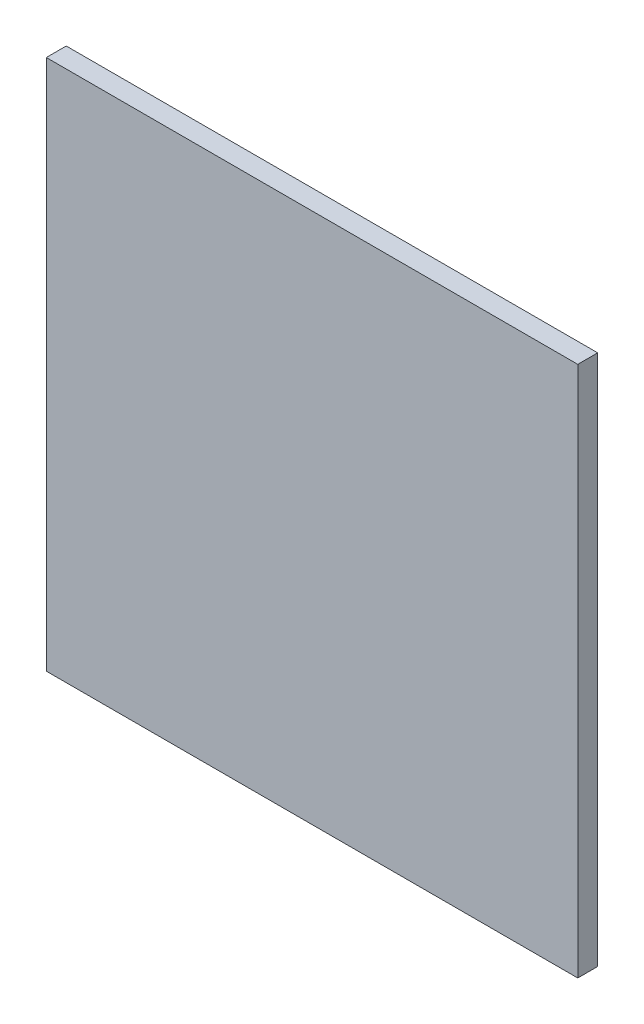
ISO-10303-21;
HEADER;
FILE_DESCRIPTION(('STEP AP214'),'2;1');
FILE_NAME('part.step','',(''),(''),'','','');
FILE_SCHEMA(('AUTOMOTIVE_DESIGN { 1 0 10303 214 1 1 1 1 }'));
ENDSEC;
DATA;
#1=APPLICATION_CONTEXT('core data for automotive mechanical design processes');
#2=APPLICATION_PROTOCOL_DEFINITION('international standard','automotive_design',2000,#1);
#3=PRODUCT_CONTEXT('',#1,'mechanical');
#4=PRODUCT('Part','Part','',(#3));
#5=PRODUCT_RELATED_PRODUCT_CATEGORY('part','',(#4));
#6=PRODUCT_DEFINITION_FORMATION('','',#4);
#7=PRODUCT_DEFINITION_CONTEXT('part definition',#1,'design');
#8=PRODUCT_DEFINITION('design','',#6,#7);
#9=PRODUCT_DEFINITION_SHAPE('','',#8);
#10=(LENGTH_UNIT() NAMED_UNIT(*) SI_UNIT(.MILLI.,.METRE.));
#11=(NAMED_UNIT(*) PLANE_ANGLE_UNIT() SI_UNIT($,.RADIAN.));
#12=(NAMED_UNIT(*) SI_UNIT($,.STERADIAN.) SOLID_ANGLE_UNIT());
#13=UNCERTAINTY_MEASURE_WITH_UNIT(LENGTH_MEASURE(1.E-05),#10,'distance_accuracy_value','');
#14=(GEOMETRIC_REPRESENTATION_CONTEXT(3) GLOBAL_UNCERTAINTY_ASSIGNED_CONTEXT((#13)) GLOBAL_UNIT_ASSIGNED_CONTEXT((#10,
#11,#12)) REPRESENTATION_CONTEXT('',''));
#15=CARTESIAN_POINT('',(0.,0.,0.));
#16=DIRECTION('',(0.,0.,1.));
#17=DIRECTION('',(1.,0.,0.));
#18=AXIS2_PLACEMENT_3D('',#15,#16,#17);
#19=CARTESIAN_POINT('',(400.,-400.,30.));
#20=DIRECTION('',(-1.,0.,0.));
#21=DIRECTION('',(0.,0.,1.));
#22=AXIS2_PLACEMENT_3D('',#19,#20,#21);
#23=PLANE('',#22);
#24=DIRECTION('',(0.,1.,0.));
#25=VECTOR('',#24,1.);
#26=CARTESIAN_POINT('',(400.,-400.,0.));
#27=LINE('',#26,#25);
#28=CARTESIAN_POINT('',(400.,-400.,0.));
#29=VERTEX_POINT('',#28);
#30=CARTESIAN_POINT('',(400.,400.,0.));
#31=VERTEX_POINT('',#30);
#32=EDGE_CURVE('E105',#29,#31,#27,.T.);
#33=ORIENTED_EDGE('',*,*,#32,.T.);
#34=DIRECTION('',(0.,0.,-1.));
#35=VECTOR('',#34,1.);
#36=CARTESIAN_POINT('',(400.,400.,30.));
#37=LINE('',#36,#35);
#38=CARTESIAN_POINT('',(400.,400.,30.));
#39=VERTEX_POINT('',#38);
#40=EDGE_CURVE('E11',#39,#31,#37,.T.);
#41=ORIENTED_EDGE('',*,*,#40,.F.);
#42=DIRECTION('',(0.,1.,0.));
#43=VECTOR('',#42,1.);
#44=CARTESIAN_POINT('',(400.,-400.,30.));
#45=LINE('',#44,#43);
#46=CARTESIAN_POINT('',(400.,-400.,30.));
#47=VERTEX_POINT('',#46);
#48=EDGE_CURVE('E89',#47,#39,#45,.T.);
#49=ORIENTED_EDGE('',*,*,#48,.F.);
#50=DIRECTION('',(0.,0.,-1.));
#51=VECTOR('',#50,1.);
#52=CARTESIAN_POINT('',(400.,-400.,30.));
#53=LINE('',#52,#51);
#54=EDGE_CURVE('E98',#47,#29,#53,.T.);
#55=ORIENTED_EDGE('',*,*,#54,.T.);
#56=EDGE_LOOP('',(#33,#41,#49,#55));
#57=FACE_BOUND('',#56,.T.);
#58=ADVANCED_FACE('F39',(#57),#23,.F.);
#59=CARTESIAN_POINT('',(-400.,400.,30.));
#60=DIRECTION('',(0.,-1.,0.));
#61=DIRECTION('',(0.,0.,-1.));
#62=AXIS2_PLACEMENT_3D('',#59,#60,#61);
#63=PLANE('',#62);
#64=DIRECTION('',(-1.,0.,0.));
#65=VECTOR('',#64,1.);
#66=CARTESIAN_POINT('',(-400.,400.,0.));
#67=LINE('',#66,#65);
#68=CARTESIAN_POINT('',(-400.,400.,0.));
#69=VERTEX_POINT('',#68);
#70=EDGE_CURVE('E94',#31,#69,#67,.T.);
#71=ORIENTED_EDGE('',*,*,#70,.T.);
#72=DIRECTION('',(0.,0.,-1.));
#73=VECTOR('',#72,1.);
#74=CARTESIAN_POINT('',(-400.,400.,30.));
#75=LINE('',#74,#73);
#76=CARTESIAN_POINT('',(-400.,400.,30.));
#77=VERTEX_POINT('',#76);
#78=EDGE_CURVE('E50',#77,#69,#75,.T.);
#79=ORIENTED_EDGE('',*,*,#78,.F.);
#80=DIRECTION('',(-1.,0.,0.));
#81=VECTOR('',#80,1.);
#82=CARTESIAN_POINT('',(-400.,400.,30.));
#83=LINE('',#82,#81);
#84=EDGE_CURVE('E83',#39,#77,#83,.T.);
#85=ORIENTED_EDGE('',*,*,#84,.F.);
#86=ORIENTED_EDGE('',*,*,#40,.T.);
#87=EDGE_LOOP('',(#71,#79,#85,#86));
#88=FACE_BOUND('',#87,.T.);
#89=ADVANCED_FACE('F91',(#88),#63,.F.);
#90=CARTESIAN_POINT('',(-400.,-400.,30.));
#91=DIRECTION('',(1.,0.,0.));
#92=DIRECTION('',(0.,0.,-1.));
#93=AXIS2_PLACEMENT_3D('',#90,#91,#92);
#94=PLANE('',#93);
#95=DIRECTION('',(0.,-1.,0.));
#96=VECTOR('',#95,1.);
#97=CARTESIAN_POINT('',(-400.,-400.,0.));
#98=LINE('',#97,#96);
#99=CARTESIAN_POINT('',(-400.,-400.,0.));
#100=VERTEX_POINT('',#99);
#101=EDGE_CURVE('E75',#69,#100,#98,.T.);
#102=ORIENTED_EDGE('',*,*,#101,.T.);
#103=DIRECTION('',(0.,0.,-1.));
#104=VECTOR('',#103,1.);
#105=CARTESIAN_POINT('',(-400.,-400.,30.));
#106=LINE('',#105,#104);
#107=CARTESIAN_POINT('',(-400.,-400.,30.));
#108=VERTEX_POINT('',#107);
#109=EDGE_CURVE('E92',#108,#100,#106,.T.);
#110=ORIENTED_EDGE('',*,*,#109,.F.);
#111=DIRECTION('',(0.,-1.,0.));
#112=VECTOR('',#111,1.);
#113=CARTESIAN_POINT('',(-400.,-400.,30.));
#114=LINE('',#113,#112);
#115=EDGE_CURVE('E86',#77,#108,#114,.T.);
#116=ORIENTED_EDGE('',*,*,#115,.F.);
#117=ORIENTED_EDGE('',*,*,#78,.T.);
#118=EDGE_LOOP('',(#102,#110,#116,#117));
#119=FACE_BOUND('',#118,.T.);
#120=ADVANCED_FACE('F96',(#119),#94,.F.);
#121=CARTESIAN_POINT('',(-400.,-400.,30.));
#122=DIRECTION('',(0.,1.,0.));
#123=DIRECTION('',(0.,0.,1.));
#124=AXIS2_PLACEMENT_3D('',#121,#122,#123);
#125=PLANE('',#124);
#126=DIRECTION('',(1.,0.,0.));
#127=VECTOR('',#126,1.);
#128=CARTESIAN_POINT('',(-400.,-400.,0.));
#129=LINE('',#128,#127);
#130=EDGE_CURVE('E77',#100,#29,#129,.T.);
#131=ORIENTED_EDGE('',*,*,#130,.T.);
#132=ORIENTED_EDGE('',*,*,#54,.F.);
#133=DIRECTION('',(1.,0.,0.));
#134=VECTOR('',#133,1.);
#135=CARTESIAN_POINT('',(-400.,-400.,30.));
#136=LINE('',#135,#134);
#137=EDGE_CURVE('E54',#108,#47,#136,.T.);
#138=ORIENTED_EDGE('',*,*,#137,.F.);
#139=ORIENTED_EDGE('',*,*,#109,.T.);
#140=EDGE_LOOP('',(#131,#132,#138,#139));
#141=FACE_BOUND('',#140,.T.);
#142=ADVANCED_FACE('F109',(#141),#125,.F.);
#143=CARTESIAN_POINT('',(0.,0.,30.));
#144=DIRECTION('',(0.,0.,-1.));
#145=DIRECTION('',(-1.,0.,0.));
#146=AXIS2_PLACEMENT_3D('',#143,#144,#145);
#147=PLANE('',#146);
#148=ORIENTED_EDGE('',*,*,#48,.T.);
#149=ORIENTED_EDGE('',*,*,#84,.T.);
#150=ORIENTED_EDGE('',*,*,#115,.T.);
#151=ORIENTED_EDGE('',*,*,#137,.T.);
#152=EDGE_LOOP('',(#148,#149,#150,#151));
#153=FACE_BOUND('',#152,.T.);
#154=ADVANCED_FACE('F88',(#153),#147,.F.);
#155=CARTESIAN_POINT('',(0.,0.,0.));
#156=DIRECTION('',(0.,0.,-1.));
#157=DIRECTION('',(-1.,0.,0.));
#158=AXIS2_PLACEMENT_3D('',#155,#156,#157);
#159=PLANE('',#158);
#160=CARTESIAN_POINT('',(325.,-325.,0.));
#161=DIRECTION('',(0.,0.,1.));
#162=DIRECTION('',(1.,0.,0.));
#163=AXIS2_PLACEMENT_3D('',#160,#161,#162);
#164=CIRCLE('',#163,10.);
#165=CARTESIAN_POINT('',(335.,-325.,0.));
#166=VERTEX_POINT('',#165);
#167=EDGE_CURVE('E120',#166,#166,#164,.T.);
#168=ORIENTED_EDGE('',*,*,#167,.T.);
#169=EDGE_LOOP('',(#168));
#170=FACE_BOUND('',#169,.T.);
#171=CARTESIAN_POINT('',(-325.,325.,0.));
#172=DIRECTION('',(0.,0.,1.));
#173=DIRECTION('',(1.,0.,0.));
#174=AXIS2_PLACEMENT_3D('',#171,#172,#173);
#175=CIRCLE('',#174,10.);
#176=CARTESIAN_POINT('',(-315.,325.,0.));
#177=VERTEX_POINT('',#176);
#178=EDGE_CURVE('E123',#177,#177,#175,.T.);
#179=ORIENTED_EDGE('',*,*,#178,.T.);
#180=EDGE_LOOP('',(#179));
#181=FACE_BOUND('',#180,.T.);
#182=CARTESIAN_POINT('',(325.,325.,0.));
#183=DIRECTION('',(0.,0.,1.));
#184=DIRECTION('',(1.,0.,0.));
#185=AXIS2_PLACEMENT_3D('',#182,#183,#184);
#186=CIRCLE('',#185,10.);
#187=CARTESIAN_POINT('',(335.,325.,0.));
#188=VERTEX_POINT('',#187);
#189=EDGE_CURVE('E127',#188,#188,#186,.T.);
#190=ORIENTED_EDGE('',*,*,#189,.T.);
#191=EDGE_LOOP('',(#190));
#192=FACE_BOUND('',#191,.T.);
#193=CARTESIAN_POINT('',(-325.,-325.,0.));
#194=DIRECTION('',(0.,0.,1.));
#195=DIRECTION('',(1.,0.,0.));
#196=AXIS2_PLACEMENT_3D('',#193,#194,#195);
#197=CIRCLE('',#196,10.);
#198=CARTESIAN_POINT('',(-315.,-325.,0.));
#199=VERTEX_POINT('',#198);
#200=EDGE_CURVE('E118',#199,#199,#197,.T.);
#201=ORIENTED_EDGE('',*,*,#200,.T.);
#202=EDGE_LOOP('',(#201));
#203=FACE_BOUND('',#202,.T.);
#204=ORIENTED_EDGE('',*,*,#32,.F.);
#205=ORIENTED_EDGE('',*,*,#130,.F.);
#206=ORIENTED_EDGE('',*,*,#101,.F.);
#207=ORIENTED_EDGE('',*,*,#70,.F.);
#208=EDGE_LOOP('',(#204,#205,#206,#207));
#209=FACE_BOUND('',#208,.T.);
#210=ADVANCED_FACE('F114',(#170,#181,#192,#203,#209),#159,.T.);
#211=CARTESIAN_POINT('',(-325.,-325.,15.));
#212=DIRECTION('',(0.,0.,-1.));
#213=DIRECTION('',(-1.,0.,0.));
#214=AXIS2_PLACEMENT_3D('',#211,#212,#213);
#215=CYLINDRICAL_SURFACE('',#214,10.);
#216=CARTESIAN_POINT('',(-325.,-325.,15.));
#217=DIRECTION('',(0.,0.,1.));
#218=DIRECTION('',(1.,0.,0.));
#219=AXIS2_PLACEMENT_3D('',#216,#217,#218);
#220=CIRCLE('',#219,10.);
#221=CARTESIAN_POINT('',(-315.,-325.,15.));
#222=VERTEX_POINT('',#221);
#223=EDGE_CURVE('E104',#222,#222,#220,.T.);
#224=ORIENTED_EDGE('',*,*,#223,.T.);
#225=EDGE_LOOP('',(#224));
#226=FACE_BOUND('',#225,.T.);
#227=ORIENTED_EDGE('',*,*,#200,.F.);
#228=EDGE_LOOP('',(#227));
#229=FACE_BOUND('',#228,.T.);
#230=ADVANCED_FACE('F154',(#226,#229),#215,.F.);
#231=CARTESIAN_POINT('',(-325.,-325.,15.));
#232=DIRECTION('',(0.,0.,1.));
#233=DIRECTION('',(1.,0.,0.));
#234=AXIS2_PLACEMENT_3D('',#231,#232,#233);
#235=PLANE('',#234);
#236=ORIENTED_EDGE('',*,*,#223,.F.);
#237=EDGE_LOOP('',(#236));
#238=FACE_BOUND('',#237,.T.);
#239=ADVANCED_FACE('F144',(#238),#235,.F.);
#240=CARTESIAN_POINT('',(325.,325.,15.));
#241=DIRECTION('',(0.,0.,-1.));
#242=DIRECTION('',(-1.,0.,0.));
#243=AXIS2_PLACEMENT_3D('',#240,#241,#242);
#244=CYLINDRICAL_SURFACE('',#243,10.);
#245=CARTESIAN_POINT('',(325.,325.,15.));
#246=DIRECTION('',(0.,0.,1.));
#247=DIRECTION('',(1.,0.,0.));
#248=AXIS2_PLACEMENT_3D('',#245,#246,#247);
#249=CIRCLE('',#248,10.);
#250=CARTESIAN_POINT('',(335.,325.,15.));
#251=VERTEX_POINT('',#250);
#252=EDGE_CURVE('E135',#251,#251,#249,.T.);
#253=ORIENTED_EDGE('',*,*,#252,.T.);
#254=EDGE_LOOP('',(#253));
#255=FACE_BOUND('',#254,.T.);
#256=ORIENTED_EDGE('',*,*,#189,.F.);
#257=EDGE_LOOP('',(#256));
#258=FACE_BOUND('',#257,.T.);
#259=ADVANCED_FACE('F142',(#255,#258),#244,.F.);
#260=CARTESIAN_POINT('',(325.,325.,15.));
#261=DIRECTION('',(0.,0.,1.));
#262=DIRECTION('',(1.,0.,0.));
#263=AXIS2_PLACEMENT_3D('',#260,#261,#262);
#264=PLANE('',#263);
#265=ORIENTED_EDGE('',*,*,#252,.F.);
#266=EDGE_LOOP('',(#265));
#267=FACE_BOUND('',#266,.T.);
#268=ADVANCED_FACE('F145',(#267),#264,.F.);
#269=CARTESIAN_POINT('',(-325.,325.,15.));
#270=DIRECTION('',(0.,0.,-1.));
#271=DIRECTION('',(-1.,0.,0.));
#272=AXIS2_PLACEMENT_3D('',#269,#270,#271);
#273=CYLINDRICAL_SURFACE('',#272,10.);
#274=CARTESIAN_POINT('',(-325.,325.,15.));
#275=DIRECTION('',(0.,0.,1.));
#276=DIRECTION('',(1.,0.,0.));
#277=AXIS2_PLACEMENT_3D('',#274,#275,#276);
#278=CIRCLE('',#277,10.);
#279=CARTESIAN_POINT('',(-315.,325.,15.));
#280=VERTEX_POINT('',#279);
#281=EDGE_CURVE('E125',#280,#280,#278,.T.);
#282=ORIENTED_EDGE('',*,*,#281,.T.);
#283=EDGE_LOOP('',(#282));
#284=FACE_BOUND('',#283,.T.);
#285=ORIENTED_EDGE('',*,*,#178,.F.);
#286=EDGE_LOOP('',(#285));
#287=FACE_BOUND('',#286,.T.);
#288=ADVANCED_FACE('F155',(#284,#287),#273,.F.);
#289=CARTESIAN_POINT('',(-325.,325.,15.));
#290=DIRECTION('',(0.,0.,1.));
#291=DIRECTION('',(1.,0.,0.));
#292=AXIS2_PLACEMENT_3D('',#289,#290,#291);
#293=PLANE('',#292);
#294=ORIENTED_EDGE('',*,*,#281,.F.);
#295=EDGE_LOOP('',(#294));
#296=FACE_BOUND('',#295,.T.);
#297=ADVANCED_FACE('F180',(#296),#293,.F.);
#298=CARTESIAN_POINT('',(325.,-325.,15.));
#299=DIRECTION('',(0.,0.,-1.));
#300=DIRECTION('',(-1.,0.,0.));
#301=AXIS2_PLACEMENT_3D('',#298,#299,#300);
#302=CYLINDRICAL_SURFACE('',#301,10.);
#303=CARTESIAN_POINT('',(325.,-325.,15.));
#304=DIRECTION('',(0.,0.,1.));
#305=DIRECTION('',(1.,0.,0.));
#306=AXIS2_PLACEMENT_3D('',#303,#304,#305);
#307=CIRCLE('',#306,10.);
#308=CARTESIAN_POINT('',(335.,-325.,15.));
#309=VERTEX_POINT('',#308);
#310=EDGE_CURVE('E129',#309,#309,#307,.T.);
#311=ORIENTED_EDGE('',*,*,#310,.T.);
#312=EDGE_LOOP('',(#311));
#313=FACE_BOUND('',#312,.T.);
#314=ORIENTED_EDGE('',*,*,#167,.F.);
#315=EDGE_LOOP('',(#314));
#316=FACE_BOUND('',#315,.T.);
#317=ADVANCED_FACE('F178',(#313,#316),#302,.F.);
#318=CARTESIAN_POINT('',(325.,-325.,15.));
#319=DIRECTION('',(0.,0.,1.));
#320=DIRECTION('',(1.,0.,0.));
#321=AXIS2_PLACEMENT_3D('',#318,#319,#320);
#322=PLANE('',#321);
#323=ORIENTED_EDGE('',*,*,#310,.F.);
#324=EDGE_LOOP('',(#323));
#325=FACE_BOUND('',#324,.T.);
#326=ADVANCED_FACE('F183',(#325),#322,.F.);
#327=CLOSED_SHELL('',(#58,#89,#120,#142,#154,#210,#230,#239,#259,#268,#288,#297,#317,#326));
#328=MANIFOLD_SOLID_BREP('B2',#327);
#329=ADVANCED_BREP_SHAPE_REPRESENTATION('',(#18,#328),#14);
#330=SHAPE_DEFINITION_REPRESENTATION(#9,#329);
ENDSEC;
END-ISO-10303-21;
